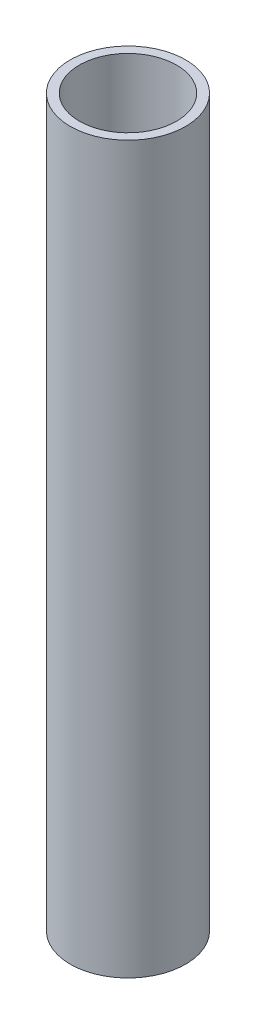
ISO-10303-21;
HEADER;
FILE_DESCRIPTION(('STEP AP214'),'2;1');
FILE_NAME('part.step','',(''),(''),'','','');
FILE_SCHEMA(('AUTOMOTIVE_DESIGN { 1 0 10303 214 1 1 1 1 }'));
ENDSEC;
DATA;
#1=APPLICATION_CONTEXT('core data for automotive mechanical design processes');
#2=APPLICATION_PROTOCOL_DEFINITION('international standard','automotive_design',2000,#1);
#3=PRODUCT_CONTEXT('',#1,'mechanical');
#4=PRODUCT('Part','Part','',(#3));
#5=PRODUCT_RELATED_PRODUCT_CATEGORY('part','',(#4));
#6=PRODUCT_DEFINITION_FORMATION('','',#4);
#7=PRODUCT_DEFINITION_CONTEXT('part definition',#1,'design');
#8=PRODUCT_DEFINITION('design','',#6,#7);
#9=PRODUCT_DEFINITION_SHAPE('','',#8);
#10=(LENGTH_UNIT() NAMED_UNIT(*) SI_UNIT(.MILLI.,.METRE.));
#11=(NAMED_UNIT(*) PLANE_ANGLE_UNIT() SI_UNIT($,.RADIAN.));
#12=(NAMED_UNIT(*) SI_UNIT($,.STERADIAN.) SOLID_ANGLE_UNIT());
#13=UNCERTAINTY_MEASURE_WITH_UNIT(LENGTH_MEASURE(1.E-05),#10,'distance_accuracy_value','');
#14=(GEOMETRIC_REPRESENTATION_CONTEXT(3) GLOBAL_UNCERTAINTY_ASSIGNED_CONTEXT((#13)) GLOBAL_UNIT_ASSIGNED_CONTEXT((#10,
#11,#12)) REPRESENTATION_CONTEXT('',''));
#15=CARTESIAN_POINT('',(0.,0.,0.));
#16=DIRECTION('',(0.,0.,1.));
#17=DIRECTION('',(1.,0.,0.));
#18=AXIS2_PLACEMENT_3D('',#15,#16,#17);
#19=CARTESIAN_POINT('',(0.,-200.,0.));
#20=DIRECTION('',(0.,1.,0.));
#21=DIRECTION('',(0.,0.,1.));
#22=AXIS2_PLACEMENT_3D('',#19,#20,#21);
#23=CYLINDRICAL_SURFACE('',#22,15.905);
#24=CARTESIAN_POINT('',(0.,-200.,0.));
#25=DIRECTION('',(0.,1.,0.));
#26=DIRECTION('',(0.,0.,1.));
#27=AXIS2_PLACEMENT_3D('',#24,#25,#26);
#28=CIRCLE('',#27,15.905);
#29=CARTESIAN_POINT('',(0.,-200.,15.905));
#30=VERTEX_POINT('',#29);
#31=EDGE_CURVE('E10',#30,#30,#28,.T.);
#32=ORIENTED_EDGE('',*,*,#31,.T.);
#33=EDGE_LOOP('',(#32));
#34=FACE_BOUND('',#33,.T.);
#35=CARTESIAN_POINT('',(0.,0.,0.));
#36=DIRECTION('',(0.,1.,0.));
#37=DIRECTION('',(0.,0.,1.));
#38=AXIS2_PLACEMENT_3D('',#35,#36,#37);
#39=CIRCLE('',#38,15.905);
#40=CARTESIAN_POINT('',(0.,0.,15.905));
#41=VERTEX_POINT('',#40);
#42=EDGE_CURVE('E40',#41,#41,#39,.T.);
#43=ORIENTED_EDGE('',*,*,#42,.F.);
#44=EDGE_LOOP('',(#43));
#45=FACE_BOUND('',#44,.T.);
#46=ADVANCED_FACE('F37',(#34,#45),#23,.T.);
#47=CARTESIAN_POINT('',(0.,-200.,0.));
#48=DIRECTION('',(0.,1.,0.));
#49=DIRECTION('',(0.,0.,1.));
#50=AXIS2_PLACEMENT_3D('',#47,#48,#49);
#51=PLANE('',#50);
#52=CARTESIAN_POINT('',(0.,-200.,0.));
#53=DIRECTION('',(0.,1.,0.));
#54=DIRECTION('',(0.,0.,1.));
#55=AXIS2_PLACEMENT_3D('',#52,#53,#54);
#56=CIRCLE('',#55,13.405);
#57=CARTESIAN_POINT('',(0.,-200.,13.405));
#58=VERTEX_POINT('',#57);
#59=EDGE_CURVE('E47',#58,#58,#56,.T.);
#60=ORIENTED_EDGE('',*,*,#59,.T.);
#61=EDGE_LOOP('',(#60));
#62=FACE_BOUND('',#61,.T.);
#63=ORIENTED_EDGE('',*,*,#31,.F.);
#64=EDGE_LOOP('',(#63));
#65=FACE_BOUND('',#64,.T.);
#66=ADVANCED_FACE('F55',(#62,#65),#51,.F.);
#67=CARTESIAN_POINT('',(0.,0.,0.));
#68=DIRECTION('',(0.,1.,0.));
#69=DIRECTION('',(0.,0.,1.));
#70=AXIS2_PLACEMENT_3D('',#67,#68,#69);
#71=PLANE('',#70);
#72=CARTESIAN_POINT('',(0.,0.,0.));
#73=DIRECTION('',(0.,1.,0.));
#74=DIRECTION('',(0.,0.,1.));
#75=AXIS2_PLACEMENT_3D('',#72,#73,#74);
#76=CIRCLE('',#75,13.405);
#77=CARTESIAN_POINT('',(0.,0.,13.405));
#78=VERTEX_POINT('',#77);
#79=EDGE_CURVE('E49',#78,#78,#76,.T.);
#80=ORIENTED_EDGE('',*,*,#79,.F.);
#81=EDGE_LOOP('',(#80));
#82=FACE_BOUND('',#81,.T.);
#83=ORIENTED_EDGE('',*,*,#42,.T.);
#84=EDGE_LOOP('',(#83));
#85=FACE_BOUND('',#84,.T.);
#86=ADVANCED_FACE('F61',(#82,#85),#71,.T.);
#87=CARTESIAN_POINT('',(0.,-200.,0.));
#88=DIRECTION('',(0.,1.,0.));
#89=DIRECTION('',(0.,0.,1.));
#90=AXIS2_PLACEMENT_3D('',#87,#88,#89);
#91=CYLINDRICAL_SURFACE('',#90,13.405);
#92=ORIENTED_EDGE('',*,*,#59,.F.);
#93=EDGE_LOOP('',(#92));
#94=FACE_BOUND('',#93,.T.);
#95=ORIENTED_EDGE('',*,*,#79,.T.);
#96=EDGE_LOOP('',(#95));
#97=FACE_BOUND('',#96,.T.);
#98=ADVANCED_FACE('F58',(#94,#97),#91,.F.);
#99=CLOSED_SHELL('',(#46,#66,#86,#98));
#100=MANIFOLD_SOLID_BREP('B2',#99);
#101=ADVANCED_BREP_SHAPE_REPRESENTATION('',(#18,#100),#14);
#102=SHAPE_DEFINITION_REPRESENTATION(#9,#101);
ENDSEC;
END-ISO-10303-21;
